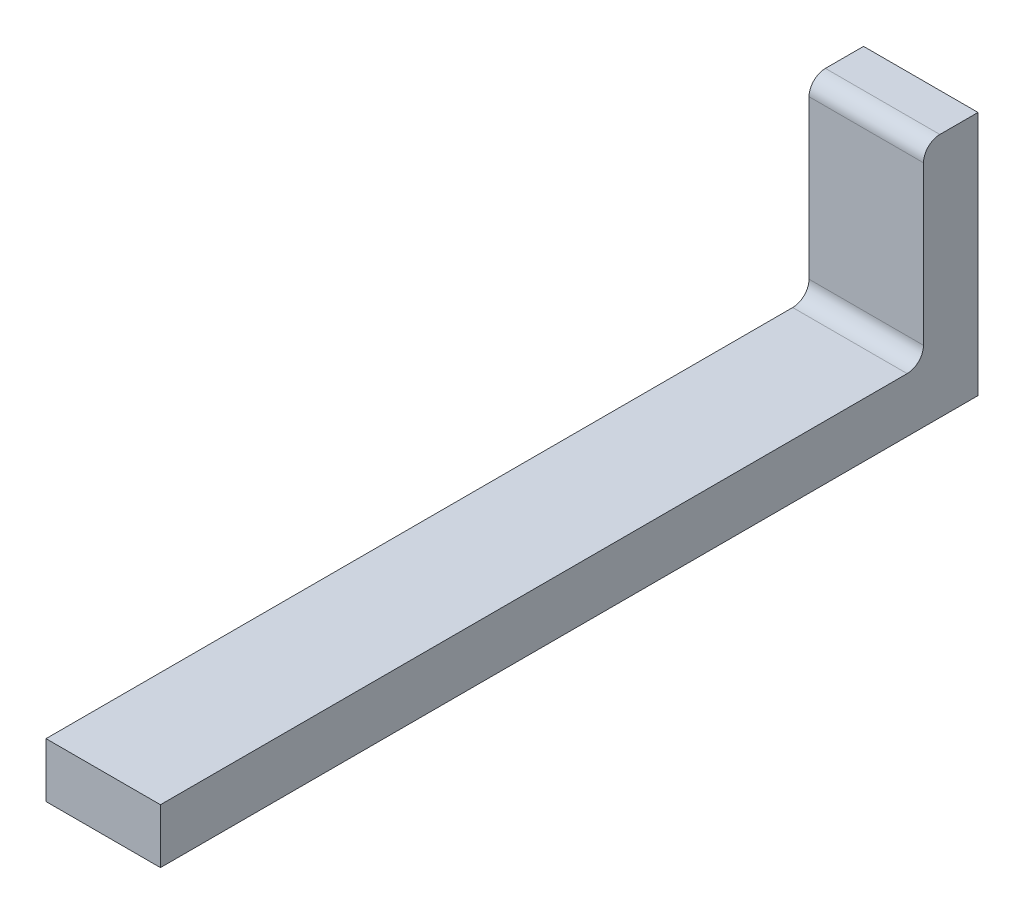
ISO-10303-21;
HEADER;
FILE_DESCRIPTION(('STEP AP214'),'2;1');
FILE_NAME('part.step','',(''),(''),'','','');
FILE_SCHEMA(('AUTOMOTIVE_DESIGN { 1 0 10303 214 1 1 1 1 }'));
ENDSEC;
DATA;
#1=APPLICATION_CONTEXT('core data for automotive mechanical design processes');
#2=APPLICATION_PROTOCOL_DEFINITION('international standard','automotive_design',2000,#1);
#3=PRODUCT_CONTEXT('',#1,'mechanical');
#4=PRODUCT('Part','Part','',(#3));
#5=PRODUCT_RELATED_PRODUCT_CATEGORY('part','',(#4));
#6=PRODUCT_DEFINITION_FORMATION('','',#4);
#7=PRODUCT_DEFINITION_CONTEXT('part definition',#1,'design');
#8=PRODUCT_DEFINITION('design','',#6,#7);
#9=PRODUCT_DEFINITION_SHAPE('','',#8);
#10=(LENGTH_UNIT() NAMED_UNIT(*) SI_UNIT(.MILLI.,.METRE.));
#11=(NAMED_UNIT(*) PLANE_ANGLE_UNIT() SI_UNIT($,.RADIAN.));
#12=(NAMED_UNIT(*) SI_UNIT($,.STERADIAN.) SOLID_ANGLE_UNIT());
#13=UNCERTAINTY_MEASURE_WITH_UNIT(LENGTH_MEASURE(1.E-05),#10,'distance_accuracy_value','');
#14=(GEOMETRIC_REPRESENTATION_CONTEXT(3) GLOBAL_UNCERTAINTY_ASSIGNED_CONTEXT((#13)) GLOBAL_UNIT_ASSIGNED_CONTEXT((#10,
#11,#12)) REPRESENTATION_CONTEXT('',''));
#15=CARTESIAN_POINT('',(0.,0.,0.));
#16=DIRECTION('',(0.,0.,1.));
#17=DIRECTION('',(1.,0.,0.));
#18=AXIS2_PLACEMENT_3D('',#15,#16,#17);
#19=CARTESIAN_POINT('',(0.,10.,0.));
#20=DIRECTION('',(0.,-1.,0.));
#21=DIRECTION('',(0.,0.,-1.));
#22=AXIS2_PLACEMENT_3D('',#19,#20,#21);
#23=PLANE('',#22);
#24=DIRECTION('',(0.,0.,1.));
#25=VECTOR('',#24,1.);
#26=CARTESIAN_POINT('',(-20.,10.,-75.));
#27=LINE('',#26,#25);
#28=CARTESIAN_POINT('',(-20.,10.,-62.));
#29=VERTEX_POINT('',#28);
#30=CARTESIAN_POINT('',(-20.,10.,75.));
#31=VERTEX_POINT('',#30);
#32=EDGE_CURVE('E105',#29,#31,#27,.T.);
#33=ORIENTED_EDGE('',*,*,#32,.F.);
#34=DIRECTION('',(-1.,0.,0.));
#35=VECTOR('',#34,1.);
#36=CARTESIAN_POINT('',(0.,10.,-62.));
#37=LINE('',#36,#35);
#38=CARTESIAN_POINT('',(-41.,10.,-62.));
#39=VERTEX_POINT('',#38);
#40=EDGE_CURVE('E155',#29,#39,#37,.T.);
#41=ORIENTED_EDGE('',*,*,#40,.T.);
#42=DIRECTION('',(0.,0.,1.));
#43=VECTOR('',#42,1.);
#44=CARTESIAN_POINT('',(-41.,10.,75.));
#45=LINE('',#44,#43);
#46=CARTESIAN_POINT('',(-41.,10.,75.));
#47=VERTEX_POINT('',#46);
#48=EDGE_CURVE('E127',#39,#47,#45,.T.);
#49=ORIENTED_EDGE('',*,*,#48,.T.);
#50=DIRECTION('',(1.,0.,0.));
#51=VECTOR('',#50,1.);
#52=CARTESIAN_POINT('',(-41.,10.,75.));
#53=LINE('',#52,#51);
#54=EDGE_CURVE('E122',#47,#31,#53,.T.);
#55=ORIENTED_EDGE('',*,*,#54,.T.);
#56=EDGE_LOOP('',(#33,#41,#49,#55));
#57=FACE_BOUND('',#56,.T.);
#58=ADVANCED_FACE('F43',(#57),#23,.F.);
#59=CARTESIAN_POINT('',(-41.,0.,-65.));
#60=DIRECTION('',(0.,0.,1.));
#61=DIRECTION('',(1.,0.,0.));
#62=AXIS2_PLACEMENT_3D('',#59,#60,#61);
#63=PLANE('',#62);
#64=DIRECTION('',(0.,-1.,0.));
#65=VECTOR('',#64,1.);
#66=CARTESIAN_POINT('',(-41.,0.,-65.));
#67=LINE('',#66,#65);
#68=CARTESIAN_POINT('',(-41.,42.,-65.));
#69=VERTEX_POINT('',#68);
#70=CARTESIAN_POINT('',(-41.,13.,-65.));
#71=VERTEX_POINT('',#70);
#72=EDGE_CURVE('E162',#69,#71,#67,.T.);
#73=ORIENTED_EDGE('',*,*,#72,.T.);
#74=DIRECTION('',(-1.,0.,0.));
#75=VECTOR('',#74,1.);
#76=CARTESIAN_POINT('',(-41.,13.,-65.));
#77=LINE('',#76,#75);
#78=CARTESIAN_POINT('',(-20.,13.,-65.));
#79=VERTEX_POINT('',#78);
#80=EDGE_CURVE('E157',#71,#79,#77,.F.);
#81=ORIENTED_EDGE('',*,*,#80,.T.);
#82=DIRECTION('',(0.,-1.,0.));
#83=VECTOR('',#82,1.);
#84=CARTESIAN_POINT('',(-20.,0.,-65.));
#85=LINE('',#84,#83);
#86=CARTESIAN_POINT('',(-20.,42.,-65.));
#87=VERTEX_POINT('',#86);
#88=EDGE_CURVE('E64',#87,#79,#85,.T.);
#89=ORIENTED_EDGE('',*,*,#88,.F.);
#90=DIRECTION('',(1.,0.,0.));
#91=VECTOR('',#90,1.);
#92=CARTESIAN_POINT('',(-41.,42.,-65.));
#93=LINE('',#92,#91);
#94=EDGE_CURVE('E149',#87,#69,#93,.F.);
#95=ORIENTED_EDGE('',*,*,#94,.T.);
#96=EDGE_LOOP('',(#73,#81,#89,#95));
#97=FACE_BOUND('',#96,.T.);
#98=ADVANCED_FACE('F160',(#97),#63,.T.);
#99=CARTESIAN_POINT('',(-41.,45.,-75.));
#100=DIRECTION('',(0.,1.,0.));
#101=DIRECTION('',(0.,0.,1.));
#102=AXIS2_PLACEMENT_3D('',#99,#100,#101);
#103=PLANE('',#102);
#104=DIRECTION('',(0.,0.,1.));
#105=VECTOR('',#104,1.);
#106=CARTESIAN_POINT('',(-41.,45.,-75.));
#107=LINE('',#106,#105);
#108=CARTESIAN_POINT('',(-41.,45.,-75.));
#109=VERTEX_POINT('',#108);
#110=CARTESIAN_POINT('',(-41.,45.,-68.));
#111=VERTEX_POINT('',#110);
#112=EDGE_CURVE('E174',#109,#111,#107,.T.);
#113=ORIENTED_EDGE('',*,*,#112,.T.);
#114=DIRECTION('',(1.,0.,0.));
#115=VECTOR('',#114,1.);
#116=CARTESIAN_POINT('',(-41.,45.,-68.));
#117=LINE('',#116,#115);
#118=CARTESIAN_POINT('',(-20.,45.,-68.));
#119=VERTEX_POINT('',#118);
#120=EDGE_CURVE('E146',#111,#119,#117,.T.);
#121=ORIENTED_EDGE('',*,*,#120,.T.);
#122=DIRECTION('',(0.,0.,1.));
#123=VECTOR('',#122,1.);
#124=CARTESIAN_POINT('',(-20.,45.,-75.));
#125=LINE('',#124,#123);
#126=CARTESIAN_POINT('',(-20.,45.,-75.));
#127=VERTEX_POINT('',#126);
#128=EDGE_CURVE('E144',#127,#119,#125,.T.);
#129=ORIENTED_EDGE('',*,*,#128,.F.);
#130=DIRECTION('',(1.,0.,0.));
#131=VECTOR('',#130,1.);
#132=CARTESIAN_POINT('',(-41.,45.,-75.));
#133=LINE('',#132,#131);
#134=EDGE_CURVE('E139',#109,#127,#133,.T.);
#135=ORIENTED_EDGE('',*,*,#134,.F.);
#136=EDGE_LOOP('',(#113,#121,#129,#135));
#137=FACE_BOUND('',#136,.T.);
#138=ADVANCED_FACE('F184',(#137),#103,.T.);
#139=CARTESIAN_POINT('',(-41.,10.,-75.));
#140=DIRECTION('',(0.,0.,1.));
#141=DIRECTION('',(1.,0.,0.));
#142=AXIS2_PLACEMENT_3D('',#139,#140,#141);
#143=PLANE('',#142);
#144=ORIENTED_EDGE('',*,*,#134,.T.);
#145=DIRECTION('',(0.,-1.,0.));
#146=VECTOR('',#145,1.);
#147=CARTESIAN_POINT('',(-20.,10.,-75.));
#148=LINE('',#147,#146);
#149=CARTESIAN_POINT('',(-20.,0.,-75.));
#150=VERTEX_POINT('',#149);
#151=EDGE_CURVE('E115',#127,#150,#148,.T.);
#152=ORIENTED_EDGE('',*,*,#151,.T.);
#153=DIRECTION('',(-1.,0.,0.));
#154=VECTOR('',#153,1.);
#155=CARTESIAN_POINT('',(-41.,0.,-75.));
#156=LINE('',#155,#154);
#157=CARTESIAN_POINT('',(-41.,0.,-75.));
#158=VERTEX_POINT('',#157);
#159=EDGE_CURVE('E136',#150,#158,#156,.T.);
#160=ORIENTED_EDGE('',*,*,#159,.T.);
#161=DIRECTION('',(0.,-1.,0.));
#162=VECTOR('',#161,1.);
#163=CARTESIAN_POINT('',(-41.,10.,-75.));
#164=LINE('',#163,#162);
#165=EDGE_CURVE('E131',#109,#158,#164,.T.);
#166=ORIENTED_EDGE('',*,*,#165,.F.);
#167=EDGE_LOOP('',(#144,#152,#160,#166));
#168=FACE_BOUND('',#167,.T.);
#169=ADVANCED_FACE('F180',(#168),#143,.F.);
#170=CARTESIAN_POINT('',(-41.,10.,75.));
#171=DIRECTION('',(1.,0.,0.));
#172=DIRECTION('',(0.,0.,-1.));
#173=AXIS2_PLACEMENT_3D('',#170,#171,#172);
#174=PLANE('',#173);
#175=ORIENTED_EDGE('',*,*,#72,.F.);
#176=CARTESIAN_POINT('',(-41.,42.,-68.));
#177=DIRECTION('',(1.,0.,0.));
#178=DIRECTION('',(0.,0.,-1.));
#179=AXIS2_PLACEMENT_3D('',#176,#177,#178);
#180=CIRCLE('',#179,3.);
#181=EDGE_CURVE('E151',#69,#111,#180,.F.);
#182=ORIENTED_EDGE('',*,*,#181,.T.);
#183=ORIENTED_EDGE('',*,*,#112,.F.);
#184=ORIENTED_EDGE('',*,*,#165,.T.);
#185=DIRECTION('',(0.,0.,1.));
#186=VECTOR('',#185,1.);
#187=CARTESIAN_POINT('',(-41.,0.,75.));
#188=LINE('',#187,#186);
#189=CARTESIAN_POINT('',(-41.,0.,75.));
#190=VERTEX_POINT('',#189);
#191=EDGE_CURVE('E138',#158,#190,#188,.T.);
#192=ORIENTED_EDGE('',*,*,#191,.T.);
#193=DIRECTION('',(0.,-1.,0.));
#194=VECTOR('',#193,1.);
#195=CARTESIAN_POINT('',(-41.,10.,75.));
#196=LINE('',#195,#194);
#197=EDGE_CURVE('E129',#47,#190,#196,.T.);
#198=ORIENTED_EDGE('',*,*,#197,.F.);
#199=ORIENTED_EDGE('',*,*,#48,.F.);
#200=CARTESIAN_POINT('',(-41.,13.,-62.));
#201=DIRECTION('',(1.,0.,0.));
#202=DIRECTION('',(0.,0.,-1.));
#203=AXIS2_PLACEMENT_3D('',#200,#201,#202);
#204=CIRCLE('',#203,3.);
#205=EDGE_CURVE('E11',#39,#71,#204,.T.);
#206=ORIENTED_EDGE('',*,*,#205,.T.);
#207=EDGE_LOOP('',(#175,#182,#183,#184,#192,#198,#199,#206));
#208=FACE_BOUND('',#207,.T.);
#209=ADVANCED_FACE('F164',(#208),#174,.F.);
#210=CARTESIAN_POINT('',(-41.,10.,75.));
#211=DIRECTION('',(0.,0.,-1.));
#212=DIRECTION('',(-1.,0.,0.));
#213=AXIS2_PLACEMENT_3D('',#210,#211,#212);
#214=PLANE('',#213);
#215=DIRECTION('',(1.,0.,0.));
#216=VECTOR('',#215,1.);
#217=CARTESIAN_POINT('',(-41.,0.,75.));
#218=LINE('',#217,#216);
#219=CARTESIAN_POINT('',(-20.,0.,75.));
#220=VERTEX_POINT('',#219);
#221=EDGE_CURVE('E124',#190,#220,#218,.T.);
#222=ORIENTED_EDGE('',*,*,#221,.T.);
#223=DIRECTION('',(0.,1.,0.));
#224=VECTOR('',#223,1.);
#225=CARTESIAN_POINT('',(-20.,10.,75.));
#226=LINE('',#225,#224);
#227=EDGE_CURVE('E108',#220,#31,#226,.T.);
#228=ORIENTED_EDGE('',*,*,#227,.T.);
#229=ORIENTED_EDGE('',*,*,#54,.F.);
#230=ORIENTED_EDGE('',*,*,#197,.T.);
#231=EDGE_LOOP('',(#222,#228,#229,#230));
#232=FACE_BOUND('',#231,.T.);
#233=ADVANCED_FACE('F120',(#232),#214,.F.);
#234=CARTESIAN_POINT('',(0.,0.,0.));
#235=DIRECTION('',(0.,-1.,0.));
#236=DIRECTION('',(0.,0.,-1.));
#237=AXIS2_PLACEMENT_3D('',#234,#235,#236);
#238=PLANE('',#237);
#239=DIRECTION('',(0.,0.,-1.));
#240=VECTOR('',#239,1.);
#241=CARTESIAN_POINT('',(-20.,0.,0.));
#242=LINE('',#241,#240);
#243=EDGE_CURVE('E125',#220,#150,#242,.T.);
#244=ORIENTED_EDGE('',*,*,#243,.F.);
#245=ORIENTED_EDGE('',*,*,#221,.F.);
#246=ORIENTED_EDGE('',*,*,#191,.F.);
#247=ORIENTED_EDGE('',*,*,#159,.F.);
#248=EDGE_LOOP('',(#244,#245,#246,#247));
#249=FACE_BOUND('',#248,.T.);
#250=ADVANCED_FACE('F167',(#249),#238,.T.);
#251=CARTESIAN_POINT('',(-41.,42.,-68.));
#252=DIRECTION('',(1.,0.,0.));
#253=DIRECTION('',(0.,0.,-1.));
#254=AXIS2_PLACEMENT_3D('',#251,#252,#253);
#255=CYLINDRICAL_SURFACE('',#254,3.);
#256=ORIENTED_EDGE('',*,*,#181,.F.);
#257=ORIENTED_EDGE('',*,*,#94,.F.);
#258=CARTESIAN_POINT('',(-20.,42.,-68.));
#259=DIRECTION('',(-1.,0.,0.));
#260=DIRECTION('',(0.,-1.,0.));
#261=AXIS2_PLACEMENT_3D('',#258,#259,#260);
#262=CIRCLE('',#261,3.);
#263=EDGE_CURVE('E153',#119,#87,#262,.F.);
#264=ORIENTED_EDGE('',*,*,#263,.F.);
#265=ORIENTED_EDGE('',*,*,#120,.F.);
#266=EDGE_LOOP('',(#256,#257,#264,#265));
#267=FACE_BOUND('',#266,.T.);
#268=ADVANCED_FACE('F188',(#267),#255,.T.);
#269=CARTESIAN_POINT('',(0.,13.,-62.));
#270=DIRECTION('',(-1.,0.,0.));
#271=DIRECTION('',(0.,0.,1.));
#272=AXIS2_PLACEMENT_3D('',#269,#270,#271);
#273=CYLINDRICAL_SURFACE('',#272,3.);
#274=CARTESIAN_POINT('',(-20.,13.,-62.));
#275=DIRECTION('',(-1.,0.,0.));
#276=DIRECTION('',(0.,-1.,0.));
#277=AXIS2_PLACEMENT_3D('',#274,#275,#276);
#278=CIRCLE('',#277,3.);
#279=EDGE_CURVE('E51',#79,#29,#278,.T.);
#280=ORIENTED_EDGE('',*,*,#279,.F.);
#281=ORIENTED_EDGE('',*,*,#80,.F.);
#282=ORIENTED_EDGE('',*,*,#205,.F.);
#283=ORIENTED_EDGE('',*,*,#40,.F.);
#284=EDGE_LOOP('',(#280,#281,#282,#283));
#285=FACE_BOUND('',#284,.T.);
#286=ADVANCED_FACE('F45',(#285),#273,.F.);
#287=CARTESIAN_POINT('',(-20.,0.,0.));
#288=DIRECTION('',(-1.,0.,0.));
#289=DIRECTION('',(0.,-1.,0.));
#290=AXIS2_PLACEMENT_3D('',#287,#288,#289);
#291=PLANE('',#290);
#292=ORIENTED_EDGE('',*,*,#227,.F.);
#293=ORIENTED_EDGE('',*,*,#243,.T.);
#294=ORIENTED_EDGE('',*,*,#151,.F.);
#295=ORIENTED_EDGE('',*,*,#128,.T.);
#296=ORIENTED_EDGE('',*,*,#263,.T.);
#297=ORIENTED_EDGE('',*,*,#88,.T.);
#298=ORIENTED_EDGE('',*,*,#279,.T.);
#299=ORIENTED_EDGE('',*,*,#32,.T.);
#300=EDGE_LOOP('',(#292,#293,#294,#295,#296,#297,#298,#299));
#301=FACE_BOUND('',#300,.T.);
#302=ADVANCED_FACE('F107',(#301),#291,.F.);
#303=CLOSED_SHELL('',(#58,#98,#138,#169,#209,#233,#250,#268,#286,#302));
#304=MANIFOLD_SOLID_BREP('B2',#303);
#305=ADVANCED_BREP_SHAPE_REPRESENTATION('',(#18,#304),#14);
#306=SHAPE_DEFINITION_REPRESENTATION(#9,#305);
ENDSEC;
END-ISO-10303-21;
